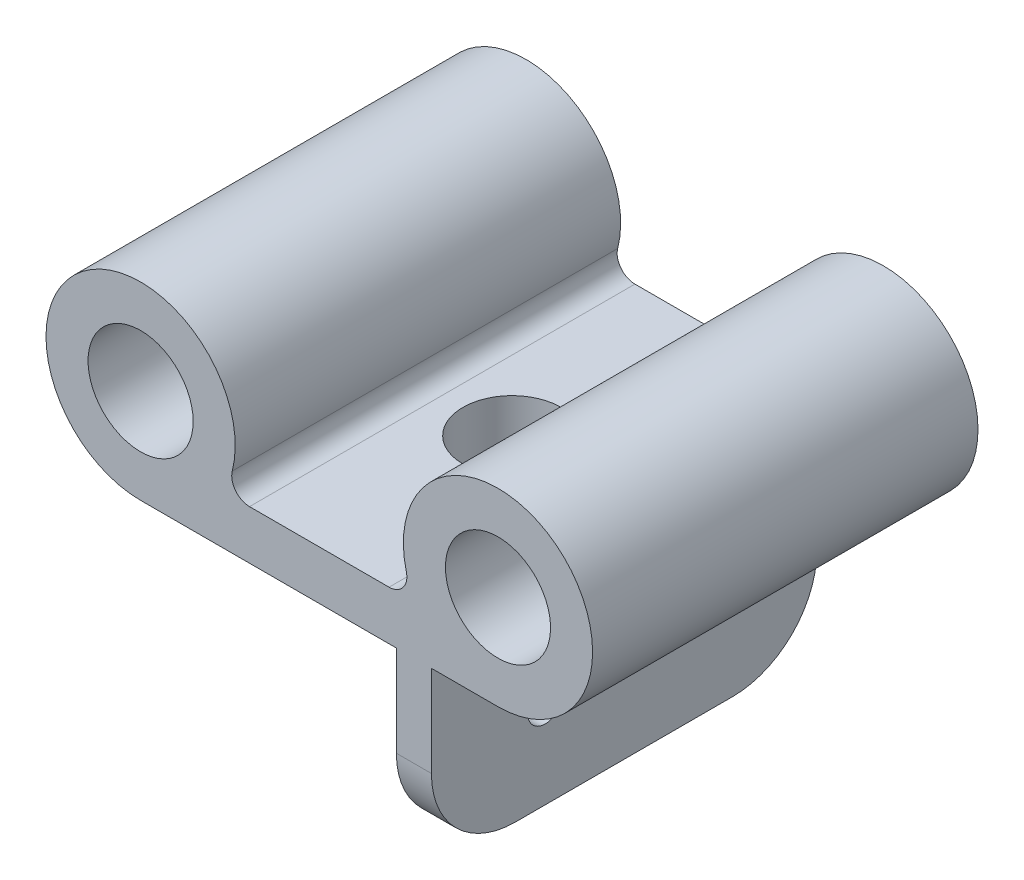
ISO-10303-21;
HEADER;
FILE_DESCRIPTION(('STEP AP214'),'2;1');
FILE_NAME('part.step','',(''),(''),'','','');
FILE_SCHEMA(('AUTOMOTIVE_DESIGN { 1 0 10303 214 1 1 1 1 }'));
ENDSEC;
DATA;
#1=APPLICATION_CONTEXT('core data for automotive mechanical design processes');
#2=APPLICATION_PROTOCOL_DEFINITION('international standard','automotive_design',2000,#1);
#3=PRODUCT_CONTEXT('',#1,'mechanical');
#4=PRODUCT('Part','Part','',(#3));
#5=PRODUCT_RELATED_PRODUCT_CATEGORY('part','',(#4));
#6=PRODUCT_DEFINITION_FORMATION('','',#4);
#7=PRODUCT_DEFINITION_CONTEXT('part definition',#1,'design');
#8=PRODUCT_DEFINITION('design','',#6,#7);
#9=PRODUCT_DEFINITION_SHAPE('','',#8);
#10=(LENGTH_UNIT() NAMED_UNIT(*) SI_UNIT(.MILLI.,.METRE.));
#11=(NAMED_UNIT(*) PLANE_ANGLE_UNIT() SI_UNIT($,.RADIAN.));
#12=(NAMED_UNIT(*) SI_UNIT($,.STERADIAN.) SOLID_ANGLE_UNIT());
#13=UNCERTAINTY_MEASURE_WITH_UNIT(LENGTH_MEASURE(1.E-05),#10,'distance_accuracy_value','');
#14=(GEOMETRIC_REPRESENTATION_CONTEXT(3) GLOBAL_UNCERTAINTY_ASSIGNED_CONTEXT((#13)) GLOBAL_UNIT_ASSIGNED_CONTEXT((#10,
#11,#12)) REPRESENTATION_CONTEXT('',''));
#15=CARTESIAN_POINT('',(0.,0.,0.));
#16=DIRECTION('',(0.,0.,1.));
#17=DIRECTION('',(1.,0.,0.));
#18=AXIS2_PLACEMENT_3D('',#15,#16,#17);
#19=CARTESIAN_POINT('',(-25.5,-13.5,55.));
#20=DIRECTION('',(0.,1.,0.));
#21=DIRECTION('',(-1.,0.,0.));
#22=AXIS2_PLACEMENT_3D('',#19,#20,#21);
#23=PLANE('',#22);
#24=DIRECTION('',(0.,0.,1.));
#25=VECTOR('',#24,1.);
#26=CARTESIAN_POINT('',(16.,-13.5,0.));
#27=LINE('',#26,#25);
#28=CARTESIAN_POINT('',(16.,-13.5,0.));
#29=VERTEX_POINT('',#28);
#30=CARTESIAN_POINT('',(16.,-13.5,55.));
#31=VERTEX_POINT('',#30);
#32=EDGE_CURVE('E147',#29,#31,#27,.T.);
#33=ORIENTED_EDGE('',*,*,#32,.F.);
#34=DIRECTION('',(1.,0.,0.));
#35=VECTOR('',#34,1.);
#36=CARTESIAN_POINT('',(-25.5,-13.5,0.));
#37=LINE('',#36,#35);
#38=CARTESIAN_POINT('',(25.5,-13.5,0.));
#39=VERTEX_POINT('',#38);
#40=EDGE_CURVE('E155',#29,#39,#37,.T.);
#41=ORIENTED_EDGE('',*,*,#40,.T.);
#42=DIRECTION('',(0.,0.,-1.));
#43=VECTOR('',#42,1.);
#44=CARTESIAN_POINT('',(25.5,-13.5,55.));
#45=LINE('',#44,#43);
#46=CARTESIAN_POINT('',(25.5,-13.5,55.));
#47=VERTEX_POINT('',#46);
#48=EDGE_CURVE('E164',#47,#39,#45,.T.);
#49=ORIENTED_EDGE('',*,*,#48,.F.);
#50=DIRECTION('',(1.,0.,0.));
#51=VECTOR('',#50,1.);
#52=CARTESIAN_POINT('',(-25.5,-13.5,55.));
#53=LINE('',#52,#51);
#54=EDGE_CURVE('E244',#31,#47,#53,.T.);
#55=ORIENTED_EDGE('',*,*,#54,.F.);
#56=EDGE_LOOP('',(#33,#41,#49,#55));
#57=FACE_BOUND('',#56,.T.);
#58=ADVANCED_FACE('F35',(#57),#23,.F.);
#59=CARTESIAN_POINT('',(25.5,0.,55.));
#60=DIRECTION('',(0.,0.,-1.));
#61=DIRECTION('',(-1.,0.,0.));
#62=AXIS2_PLACEMENT_3D('',#59,#60,#61);
#63=PLANE('',#62);
#64=DIRECTION('',(0.,1.,0.));
#65=VECTOR('',#64,1.);
#66=CARTESIAN_POINT('',(11.,-38.5,55.));
#67=LINE('',#66,#65);
#68=CARTESIAN_POINT('',(11.,-26.5,55.));
#69=VERTEX_POINT('',#68);
#70=CARTESIAN_POINT('',(11.,-13.5,55.));
#71=VERTEX_POINT('',#70);
#72=EDGE_CURVE('E143',#69,#71,#67,.T.);
#73=ORIENTED_EDGE('',*,*,#72,.F.);
#74=DIRECTION('',(-1.,0.,0.));
#75=VECTOR('',#74,1.);
#76=CARTESIAN_POINT('',(16.,-26.5,55.));
#77=LINE('',#76,#75);
#78=CARTESIAN_POINT('',(16.,-26.5,55.));
#79=VERTEX_POINT('',#78);
#80=EDGE_CURVE('E60',#69,#79,#77,.F.);
#81=ORIENTED_EDGE('',*,*,#80,.T.);
#82=DIRECTION('',(0.,1.,0.));
#83=VECTOR('',#82,1.);
#84=CARTESIAN_POINT('',(16.,-38.5,55.));
#85=LINE('',#84,#83);
#86=EDGE_CURVE('E225',#79,#31,#85,.T.);
#87=ORIENTED_EDGE('',*,*,#86,.T.);
#88=ORIENTED_EDGE('',*,*,#54,.T.);
#89=CARTESIAN_POINT('',(25.5,0.,55.));
#90=DIRECTION('',(0.,0.,1.));
#91=DIRECTION('',(-1.,0.,0.));
#92=AXIS2_PLACEMENT_3D('',#89,#90,#91);
#93=CIRCLE('',#92,13.5);
#94=CARTESIAN_POINT('',(12.4178878017809,-3.33291770573566,55.));
#95=VERTEX_POINT('',#94);
#96=EDGE_CURVE('E154',#47,#95,#93,.T.);
#97=ORIENTED_EDGE('',*,*,#96,.T.);
#98=CARTESIAN_POINT('',(9.95651261781964,-3.96,55.));
#99=DIRECTION('',(0.,0.,-1.));
#100=DIRECTION('',(-1.,0.,0.));
#101=AXIS2_PLACEMENT_3D('',#98,#99,#100);
#102=CIRCLE('',#101,2.54);
#103=CARTESIAN_POINT('',(9.95651261781964,-6.5,55.));
#104=VERTEX_POINT('',#103);
#105=EDGE_CURVE('E181',#95,#104,#102,.T.);
#106=ORIENTED_EDGE('',*,*,#105,.T.);
#107=DIRECTION('',(-1.,0.,0.));
#108=VECTOR('',#107,1.);
#109=CARTESIAN_POINT('',(-13.6678404338008,-6.5,55.));
#110=LINE('',#109,#108);
#111=CARTESIAN_POINT('',(-9.95651261781964,-6.5,55.));
#112=VERTEX_POINT('',#111);
#113=EDGE_CURVE('E158',#104,#112,#110,.T.);
#114=ORIENTED_EDGE('',*,*,#113,.T.);
#115=CARTESIAN_POINT('',(-9.95651261781964,-3.96,55.));
#116=DIRECTION('',(0.,0.,-1.));
#117=DIRECTION('',(-1.,0.,0.));
#118=AXIS2_PLACEMENT_3D('',#115,#116,#117);
#119=CIRCLE('',#118,2.54);
#120=CARTESIAN_POINT('',(-12.4178878017809,-3.33291770573566,55.));
#121=VERTEX_POINT('',#120);
#122=EDGE_CURVE('E185',#112,#121,#119,.T.);
#123=ORIENTED_EDGE('',*,*,#122,.T.);
#124=CARTESIAN_POINT('',(-25.5,0.,55.));
#125=DIRECTION('',(0.,0.,1.));
#126=DIRECTION('',(1.,0.,0.));
#127=AXIS2_PLACEMENT_3D('',#124,#125,#126);
#128=CIRCLE('',#127,13.5);
#129=CARTESIAN_POINT('',(-25.5,-13.5,55.));
#130=VERTEX_POINT('',#129);
#131=EDGE_CURVE('E242',#121,#130,#128,.T.);
#132=ORIENTED_EDGE('',*,*,#131,.T.);
#133=EDGE_CURVE('E167',#130,#71,#53,.T.);
#134=ORIENTED_EDGE('',*,*,#133,.T.);
#135=EDGE_LOOP('',(#73,#81,#87,#88,#97,#106,#114,#123,#132,#134));
#136=FACE_BOUND('',#135,.T.);
#137=CARTESIAN_POINT('',(-25.5,0.,55.));
#138=DIRECTION('',(0.,0.,1.));
#139=DIRECTION('',(1.,0.,0.));
#140=AXIS2_PLACEMENT_3D('',#137,#138,#139);
#141=CIRCLE('',#140,7.5);
#142=CARTESIAN_POINT('',(-18.,0.,55.));
#143=VERTEX_POINT('',#142);
#144=EDGE_CURVE('E234',#143,#143,#141,.T.);
#145=ORIENTED_EDGE('',*,*,#144,.F.);
#146=EDGE_LOOP('',(#145));
#147=FACE_BOUND('',#146,.T.);
#148=CARTESIAN_POINT('',(25.5,0.,55.));
#149=DIRECTION('',(0.,0.,1.));
#150=DIRECTION('',(-1.,0.,0.));
#151=AXIS2_PLACEMENT_3D('',#148,#149,#150);
#152=CIRCLE('',#151,7.5);
#153=CARTESIAN_POINT('',(18.,0.,55.));
#154=VERTEX_POINT('',#153);
#155=EDGE_CURVE('E228',#154,#154,#152,.T.);
#156=ORIENTED_EDGE('',*,*,#155,.F.);
#157=EDGE_LOOP('',(#156));
#158=FACE_BOUND('',#157,.T.);
#159=ADVANCED_FACE('F262',(#136,#147,#158),#63,.F.);
#160=CARTESIAN_POINT('',(25.5,0.,0.));
#161=DIRECTION('',(0.,0.,-1.));
#162=DIRECTION('',(-1.,0.,0.));
#163=AXIS2_PLACEMENT_3D('',#160,#161,#162);
#164=PLANE('',#163);
#165=CARTESIAN_POINT('',(-25.5,0.,0.));
#166=DIRECTION('',(0.,0.,1.));
#167=DIRECTION('',(1.,0.,0.));
#168=AXIS2_PLACEMENT_3D('',#165,#166,#167);
#169=CIRCLE('',#168,7.5);
#170=CARTESIAN_POINT('',(-18.,0.,0.));
#171=VERTEX_POINT('',#170);
#172=EDGE_CURVE('E231',#171,#171,#169,.T.);
#173=ORIENTED_EDGE('',*,*,#172,.T.);
#174=EDGE_LOOP('',(#173));
#175=FACE_BOUND('',#174,.T.);
#176=DIRECTION('',(0.,1.,0.));
#177=VECTOR('',#176,1.);
#178=CARTESIAN_POINT('',(16.,-38.5,0.));
#179=LINE('',#178,#177);
#180=CARTESIAN_POINT('',(16.,-26.5,0.));
#181=VERTEX_POINT('',#180);
#182=EDGE_CURVE('E137',#181,#29,#179,.T.);
#183=ORIENTED_EDGE('',*,*,#182,.F.);
#184=DIRECTION('',(1.,0.,0.));
#185=VECTOR('',#184,1.);
#186=CARTESIAN_POINT('',(25.5,-26.5,0.));
#187=LINE('',#186,#185);
#188=CARTESIAN_POINT('',(11.,-26.5,0.));
#189=VERTEX_POINT('',#188);
#190=EDGE_CURVE('E11',#181,#189,#187,.F.);
#191=ORIENTED_EDGE('',*,*,#190,.T.);
#192=DIRECTION('',(0.,1.,0.));
#193=VECTOR('',#192,1.);
#194=CARTESIAN_POINT('',(11.,-38.5,0.));
#195=LINE('',#194,#193);
#196=CARTESIAN_POINT('',(11.,-13.5,0.));
#197=VERTEX_POINT('',#196);
#198=EDGE_CURVE('E126',#189,#197,#195,.T.);
#199=ORIENTED_EDGE('',*,*,#198,.T.);
#200=CARTESIAN_POINT('',(-25.5,-13.5,0.));
#201=VERTEX_POINT('',#200);
#202=EDGE_CURVE('E132',#201,#197,#37,.T.);
#203=ORIENTED_EDGE('',*,*,#202,.F.);
#204=CARTESIAN_POINT('',(-25.5,0.,0.));
#205=DIRECTION('',(0.,0.,1.));
#206=DIRECTION('',(1.,0.,0.));
#207=AXIS2_PLACEMENT_3D('',#204,#205,#206);
#208=CIRCLE('',#207,13.5);
#209=CARTESIAN_POINT('',(-12.4178878017809,-3.33291770573566,0.));
#210=VERTEX_POINT('',#209);
#211=EDGE_CURVE('E160',#210,#201,#208,.T.);
#212=ORIENTED_EDGE('',*,*,#211,.F.);
#213=CARTESIAN_POINT('',(-9.95651261781964,-3.96,0.));
#214=DIRECTION('',(0.,0.,-1.));
#215=DIRECTION('',(-1.,0.,0.));
#216=AXIS2_PLACEMENT_3D('',#213,#214,#215);
#217=CIRCLE('',#216,2.54);
#218=CARTESIAN_POINT('',(-9.95651261781964,-6.5,0.));
#219=VERTEX_POINT('',#218);
#220=EDGE_CURVE('E183',#210,#219,#217,.F.);
#221=ORIENTED_EDGE('',*,*,#220,.T.);
#222=DIRECTION('',(-1.,0.,0.));
#223=VECTOR('',#222,1.);
#224=CARTESIAN_POINT('',(-13.6678404338008,-6.5,0.));
#225=LINE('',#224,#223);
#226=CARTESIAN_POINT('',(9.95651261781964,-6.5,0.));
#227=VERTEX_POINT('',#226);
#228=EDGE_CURVE('E247',#227,#219,#225,.T.);
#229=ORIENTED_EDGE('',*,*,#228,.F.);
#230=CARTESIAN_POINT('',(9.95651261781964,-3.96,0.));
#231=DIRECTION('',(0.,0.,-1.));
#232=DIRECTION('',(-1.,0.,0.));
#233=AXIS2_PLACEMENT_3D('',#230,#231,#232);
#234=CIRCLE('',#233,2.54);
#235=CARTESIAN_POINT('',(12.4178878017809,-3.33291770573566,0.));
#236=VERTEX_POINT('',#235);
#237=EDGE_CURVE('E179',#227,#236,#234,.F.);
#238=ORIENTED_EDGE('',*,*,#237,.T.);
#239=CARTESIAN_POINT('',(25.5,0.,0.));
#240=DIRECTION('',(0.,0.,1.));
#241=DIRECTION('',(-1.,0.,0.));
#242=AXIS2_PLACEMENT_3D('',#239,#240,#241);
#243=CIRCLE('',#242,13.5);
#244=EDGE_CURVE('E237',#39,#236,#243,.T.);
#245=ORIENTED_EDGE('',*,*,#244,.F.);
#246=ORIENTED_EDGE('',*,*,#40,.F.);
#247=EDGE_LOOP('',(#183,#191,#199,#203,#212,#221,#229,#238,#245,#246));
#248=FACE_BOUND('',#247,.T.);
#249=CARTESIAN_POINT('',(25.5,0.,0.));
#250=DIRECTION('',(0.,0.,1.));
#251=DIRECTION('',(-1.,0.,0.));
#252=AXIS2_PLACEMENT_3D('',#249,#250,#251);
#253=CIRCLE('',#252,7.5);
#254=CARTESIAN_POINT('',(18.,0.,0.));
#255=VERTEX_POINT('',#254);
#256=EDGE_CURVE('E136',#255,#255,#253,.T.);
#257=ORIENTED_EDGE('',*,*,#256,.T.);
#258=EDGE_LOOP('',(#257));
#259=FACE_BOUND('',#258,.T.);
#260=ADVANCED_FACE('F128',(#175,#248,#259),#164,.T.);
#261=CARTESIAN_POINT('',(25.5,0.,55.));
#262=DIRECTION('',(0.,0.,-1.));
#263=DIRECTION('',(-1.,0.,0.));
#264=AXIS2_PLACEMENT_3D('',#261,#262,#263);
#265=CYLINDRICAL_SURFACE('',#264,13.5);
#266=ORIENTED_EDGE('',*,*,#244,.T.);
#267=DIRECTION('',(0.,0.,-1.));
#268=VECTOR('',#267,1.);
#269=CARTESIAN_POINT('',(12.4178878017809,-3.33291770573566,55.));
#270=LINE('',#269,#268);
#271=EDGE_CURVE('E174',#236,#95,#270,.F.);
#272=ORIENTED_EDGE('',*,*,#271,.T.);
#273=ORIENTED_EDGE('',*,*,#96,.F.);
#274=ORIENTED_EDGE('',*,*,#48,.T.);
#275=EDGE_LOOP('',(#266,#272,#273,#274));
#276=FACE_BOUND('',#275,.T.);
#277=ADVANCED_FACE('F272',(#276),#265,.T.);
#278=CARTESIAN_POINT('',(-13.6678404338008,-6.5,55.));
#279=DIRECTION('',(0.,-1.,0.));
#280=DIRECTION('',(1.,0.,0.));
#281=AXIS2_PLACEMENT_3D('',#278,#279,#280);
#282=PLANE('',#281);
#283=CARTESIAN_POINT('',(0.,-6.5,27.5));
#284=DIRECTION('',(0.,-1.,0.));
#285=DIRECTION('',(1.,0.,0.));
#286=AXIS2_PLACEMENT_3D('',#283,#284,#285);
#287=CIRCLE('',#286,7.);
#288=CARTESIAN_POINT('',(6.99999999999999,-6.5,27.5));
#289=VERTEX_POINT('',#288);
#290=EDGE_CURVE('E148',#289,#289,#287,.T.);
#291=ORIENTED_EDGE('',*,*,#290,.T.);
#292=EDGE_LOOP('',(#291));
#293=FACE_BOUND('',#292,.T.);
#294=ORIENTED_EDGE('',*,*,#113,.F.);
#295=DIRECTION('',(0.,0.,1.));
#296=VECTOR('',#295,1.);
#297=CARTESIAN_POINT('',(9.95651261781964,-6.5,0.));
#298=LINE('',#297,#296);
#299=EDGE_CURVE('E171',#104,#227,#298,.F.);
#300=ORIENTED_EDGE('',*,*,#299,.T.);
#301=ORIENTED_EDGE('',*,*,#228,.T.);
#302=DIRECTION('',(0.,0.,1.));
#303=VECTOR('',#302,1.);
#304=CARTESIAN_POINT('',(-9.95651261781964,-6.5,55.));
#305=LINE('',#304,#303);
#306=EDGE_CURVE('E169',#219,#112,#305,.T.);
#307=ORIENTED_EDGE('',*,*,#306,.T.);
#308=EDGE_LOOP('',(#294,#300,#301,#307));
#309=FACE_BOUND('',#308,.T.);
#310=ADVANCED_FACE('F260',(#293,#309),#282,.F.);
#311=CARTESIAN_POINT('',(-25.5,0.,55.));
#312=DIRECTION('',(0.,0.,-1.));
#313=DIRECTION('',(-1.,0.,0.));
#314=AXIS2_PLACEMENT_3D('',#311,#312,#313);
#315=CYLINDRICAL_SURFACE('',#314,13.5);
#316=ORIENTED_EDGE('',*,*,#131,.F.);
#317=DIRECTION('',(0.,0.,-1.));
#318=VECTOR('',#317,1.);
#319=CARTESIAN_POINT('',(-12.4178878017809,-3.33291770573566,55.));
#320=LINE('',#319,#318);
#321=EDGE_CURVE('E176',#121,#210,#320,.T.);
#322=ORIENTED_EDGE('',*,*,#321,.T.);
#323=ORIENTED_EDGE('',*,*,#211,.T.);
#324=DIRECTION('',(0.,0.,-1.));
#325=VECTOR('',#324,1.);
#326=CARTESIAN_POINT('',(-25.5,-13.5,55.));
#327=LINE('',#326,#325);
#328=EDGE_CURVE('E153',#130,#201,#327,.T.);
#329=ORIENTED_EDGE('',*,*,#328,.F.);
#330=EDGE_LOOP('',(#316,#322,#323,#329));
#331=FACE_BOUND('',#330,.T.);
#332=ADVANCED_FACE('F254',(#331),#315,.T.);
#333=CARTESIAN_POINT('',(0.,-13.5,27.5));
#334=DIRECTION('',(0.,-1.,0.));
#335=DIRECTION('',(1.,0.,0.));
#336=AXIS2_PLACEMENT_3D('',#333,#334,#335);
#337=CIRCLE('',#336,7.);
#338=CARTESIAN_POINT('',(6.99999999999999,-13.5,27.5));
#339=VERTEX_POINT('',#338);
#340=EDGE_CURVE('E201',#339,#339,#337,.T.);
#341=ORIENTED_EDGE('',*,*,#340,.F.);
#342=EDGE_LOOP('',(#341));
#343=FACE_BOUND('',#342,.T.);
#344=ORIENTED_EDGE('',*,*,#202,.T.);
#345=DIRECTION('',(0.,0.,1.));
#346=VECTOR('',#345,1.);
#347=CARTESIAN_POINT('',(11.,-13.5,0.));
#348=LINE('',#347,#346);
#349=EDGE_CURVE('E140',#197,#71,#348,.T.);
#350=ORIENTED_EDGE('',*,*,#349,.T.);
#351=ORIENTED_EDGE('',*,*,#133,.F.);
#352=ORIENTED_EDGE('',*,*,#328,.T.);
#353=EDGE_LOOP('',(#344,#350,#351,#352));
#354=FACE_BOUND('',#353,.T.);
#355=ADVANCED_FACE('F151',(#343,#354),#23,.F.);
#356=CARTESIAN_POINT('',(-25.5,0.,55.));
#357=DIRECTION('',(0.,0.,-1.));
#358=DIRECTION('',(-1.,0.,0.));
#359=AXIS2_PLACEMENT_3D('',#356,#357,#358);
#360=CYLINDRICAL_SURFACE('',#359,7.5);
#361=ORIENTED_EDGE('',*,*,#144,.T.);
#362=EDGE_LOOP('',(#361));
#363=FACE_BOUND('',#362,.T.);
#364=ORIENTED_EDGE('',*,*,#172,.F.);
#365=EDGE_LOOP('',(#364));
#366=FACE_BOUND('',#365,.T.);
#367=ADVANCED_FACE('F307',(#363,#366),#360,.F.);
#368=CARTESIAN_POINT('',(25.5,0.,55.));
#369=DIRECTION('',(0.,0.,-1.));
#370=DIRECTION('',(-1.,0.,0.));
#371=AXIS2_PLACEMENT_3D('',#368,#369,#370);
#372=CYLINDRICAL_SURFACE('',#371,7.5);
#373=ORIENTED_EDGE('',*,*,#155,.T.);
#374=EDGE_LOOP('',(#373));
#375=FACE_BOUND('',#374,.T.);
#376=ORIENTED_EDGE('',*,*,#256,.F.);
#377=EDGE_LOOP('',(#376));
#378=FACE_BOUND('',#377,.T.);
#379=ADVANCED_FACE('F313',(#375,#378),#372,.F.);
#380=CARTESIAN_POINT('',(9.95651261781964,-3.96,55.));
#381=DIRECTION('',(0.,0.,-1.));
#382=DIRECTION('',(-1.,0.,0.));
#383=AXIS2_PLACEMENT_3D('',#380,#381,#382);
#384=CYLINDRICAL_SURFACE('',#383,2.54);
#385=ORIENTED_EDGE('',*,*,#105,.F.);
#386=ORIENTED_EDGE('',*,*,#271,.F.);
#387=ORIENTED_EDGE('',*,*,#237,.F.);
#388=ORIENTED_EDGE('',*,*,#299,.F.);
#389=EDGE_LOOP('',(#385,#386,#387,#388));
#390=FACE_BOUND('',#389,.T.);
#391=ADVANCED_FACE('F268',(#390),#384,.F.);
#392=CARTESIAN_POINT('',(-9.95651261781964,-3.96,55.));
#393=DIRECTION('',(0.,0.,-1.));
#394=DIRECTION('',(-1.,0.,0.));
#395=AXIS2_PLACEMENT_3D('',#392,#393,#394);
#396=CYLINDRICAL_SURFACE('',#395,2.54);
#397=ORIENTED_EDGE('',*,*,#122,.F.);
#398=ORIENTED_EDGE('',*,*,#306,.F.);
#399=ORIENTED_EDGE('',*,*,#220,.F.);
#400=ORIENTED_EDGE('',*,*,#321,.F.);
#401=EDGE_LOOP('',(#397,#398,#399,#400));
#402=FACE_BOUND('',#401,.T.);
#403=ADVANCED_FACE('F258',(#402),#396,.F.);
#404=CARTESIAN_POINT('',(11.,-38.5,0.));
#405=DIRECTION('',(-1.,0.,0.));
#406=DIRECTION('',(0.,-1.,0.));
#407=AXIS2_PLACEMENT_3D('',#404,#405,#406);
#408=PLANE('',#407);
#409=CARTESIAN_POINT('',(11.,-26.,38.75));
#410=DIRECTION('',(-1.,0.,0.));
#411=DIRECTION('',(0.,-1.,0.));
#412=AXIS2_PLACEMENT_3D('',#409,#410,#411);
#413=CIRCLE('',#412,2.5);
#414=CARTESIAN_POINT('',(11.,-28.5,38.75));
#415=VERTEX_POINT('',#414);
#416=EDGE_CURVE('E212',#415,#415,#413,.T.);
#417=ORIENTED_EDGE('',*,*,#416,.F.);
#418=EDGE_LOOP('',(#417));
#419=FACE_BOUND('',#418,.T.);
#420=CARTESIAN_POINT('',(11.,-26.,16.25));
#421=DIRECTION('',(-1.,0.,0.));
#422=DIRECTION('',(0.,-1.,0.));
#423=AXIS2_PLACEMENT_3D('',#420,#421,#422);
#424=CIRCLE('',#423,2.5);
#425=CARTESIAN_POINT('',(11.,-28.5,16.25));
#426=VERTEX_POINT('',#425);
#427=EDGE_CURVE('E202',#426,#426,#424,.T.);
#428=ORIENTED_EDGE('',*,*,#427,.F.);
#429=EDGE_LOOP('',(#428));
#430=FACE_BOUND('',#429,.T.);
#431=DIRECTION('',(0.,0.,1.));
#432=VECTOR('',#431,1.);
#433=CARTESIAN_POINT('',(11.,-38.5,0.));
#434=LINE('',#433,#432);
#435=CARTESIAN_POINT('',(11.,-38.5,12.));
#436=VERTEX_POINT('',#435);
#437=CARTESIAN_POINT('',(11.,-38.5,43.));
#438=VERTEX_POINT('',#437);
#439=EDGE_CURVE('E217',#436,#438,#434,.T.);
#440=ORIENTED_EDGE('',*,*,#439,.T.);
#441=CARTESIAN_POINT('',(11.,-26.5,43.));
#442=DIRECTION('',(-1.,0.,0.));
#443=DIRECTION('',(0.,-1.,0.));
#444=AXIS2_PLACEMENT_3D('',#441,#442,#443);
#445=CIRCLE('',#444,12.);
#446=EDGE_CURVE('E195',#438,#69,#445,.T.);
#447=ORIENTED_EDGE('',*,*,#446,.T.);
#448=ORIENTED_EDGE('',*,*,#72,.T.);
#449=ORIENTED_EDGE('',*,*,#349,.F.);
#450=ORIENTED_EDGE('',*,*,#198,.F.);
#451=CARTESIAN_POINT('',(11.,-26.5,12.));
#452=DIRECTION('',(-1.,0.,0.));
#453=DIRECTION('',(0.,-1.,0.));
#454=AXIS2_PLACEMENT_3D('',#451,#452,#453);
#455=CIRCLE('',#454,12.);
#456=EDGE_CURVE('E193',#189,#436,#455,.T.);
#457=ORIENTED_EDGE('',*,*,#456,.T.);
#458=EDGE_LOOP('',(#440,#447,#448,#449,#450,#457));
#459=FACE_BOUND('',#458,.T.);
#460=ADVANCED_FACE('F142',(#419,#430,#459),#408,.T.);
#461=CARTESIAN_POINT('',(16.,-38.5,0.));
#462=DIRECTION('',(-1.,0.,0.));
#463=DIRECTION('',(0.,-1.,0.));
#464=AXIS2_PLACEMENT_3D('',#461,#462,#463);
#465=PLANE('',#464);
#466=CARTESIAN_POINT('',(16.,-26.,38.75));
#467=DIRECTION('',(-1.,0.,0.));
#468=DIRECTION('',(0.,-1.,0.));
#469=AXIS2_PLACEMENT_3D('',#466,#467,#468);
#470=CIRCLE('',#469,2.5);
#471=CARTESIAN_POINT('',(16.,-28.5,38.75));
#472=VERTEX_POINT('',#471);
#473=EDGE_CURVE('E39',#472,#472,#470,.T.);
#474=ORIENTED_EDGE('',*,*,#473,.T.);
#475=EDGE_LOOP('',(#474));
#476=FACE_BOUND('',#475,.T.);
#477=CARTESIAN_POINT('',(16.,-26.,16.25));
#478=DIRECTION('',(-1.,0.,0.));
#479=DIRECTION('',(0.,-1.,0.));
#480=AXIS2_PLACEMENT_3D('',#477,#478,#479);
#481=CIRCLE('',#480,2.5);
#482=CARTESIAN_POINT('',(16.,-28.5,16.25));
#483=VERTEX_POINT('',#482);
#484=EDGE_CURVE('E199',#483,#483,#481,.T.);
#485=ORIENTED_EDGE('',*,*,#484,.T.);
#486=EDGE_LOOP('',(#485));
#487=FACE_BOUND('',#486,.T.);
#488=ORIENTED_EDGE('',*,*,#86,.F.);
#489=CARTESIAN_POINT('',(16.,-26.5,43.));
#490=DIRECTION('',(-1.,0.,0.));
#491=DIRECTION('',(0.,-1.,0.));
#492=AXIS2_PLACEMENT_3D('',#489,#490,#491);
#493=CIRCLE('',#492,12.);
#494=CARTESIAN_POINT('',(16.,-38.5,43.));
#495=VERTEX_POINT('',#494);
#496=EDGE_CURVE('E44',#79,#495,#493,.F.);
#497=ORIENTED_EDGE('',*,*,#496,.T.);
#498=DIRECTION('',(0.,0.,1.));
#499=VECTOR('',#498,1.);
#500=CARTESIAN_POINT('',(16.,-38.5,0.));
#501=LINE('',#500,#499);
#502=CARTESIAN_POINT('',(16.,-38.5,12.));
#503=VERTEX_POINT('',#502);
#504=EDGE_CURVE('E219',#503,#495,#501,.T.);
#505=ORIENTED_EDGE('',*,*,#504,.F.);
#506=CARTESIAN_POINT('',(16.,-26.5,12.));
#507=DIRECTION('',(-1.,0.,0.));
#508=DIRECTION('',(0.,-1.,0.));
#509=AXIS2_PLACEMENT_3D('',#506,#507,#508);
#510=CIRCLE('',#509,12.);
#511=EDGE_CURVE('E52',#503,#181,#510,.F.);
#512=ORIENTED_EDGE('',*,*,#511,.T.);
#513=ORIENTED_EDGE('',*,*,#182,.T.);
#514=ORIENTED_EDGE('',*,*,#32,.T.);
#515=EDGE_LOOP('',(#488,#497,#505,#512,#513,#514));
#516=FACE_BOUND('',#515,.T.);
#517=ADVANCED_FACE('F286',(#476,#487,#516),#465,.F.);
#518=CARTESIAN_POINT('',(0.,-38.5,0.));
#519=DIRECTION('',(0.,-1.,0.));
#520=DIRECTION('',(1.,0.,0.));
#521=AXIS2_PLACEMENT_3D('',#518,#519,#520);
#522=PLANE('',#521);
#523=ORIENTED_EDGE('',*,*,#504,.T.);
#524=DIRECTION('',(-1.,0.,0.));
#525=VECTOR('',#524,1.);
#526=CARTESIAN_POINT('',(11.,-38.5,43.));
#527=LINE('',#526,#525);
#528=EDGE_CURVE('E190',#495,#438,#527,.T.);
#529=ORIENTED_EDGE('',*,*,#528,.T.);
#530=ORIENTED_EDGE('',*,*,#439,.F.);
#531=DIRECTION('',(1.,0.,0.));
#532=VECTOR('',#531,1.);
#533=CARTESIAN_POINT('',(0.,-38.5,12.));
#534=LINE('',#533,#532);
#535=EDGE_CURVE('E187',#436,#503,#534,.T.);
#536=ORIENTED_EDGE('',*,*,#535,.T.);
#537=EDGE_LOOP('',(#523,#529,#530,#536));
#538=FACE_BOUND('',#537,.T.);
#539=ADVANCED_FACE('F281',(#538),#522,.T.);
#540=CARTESIAN_POINT('',(0.,13.5,27.5));
#541=DIRECTION('',(0.,-1.,0.));
#542=DIRECTION('',(1.,0.,0.));
#543=AXIS2_PLACEMENT_3D('',#540,#541,#542);
#544=CYLINDRICAL_SURFACE('',#543,7.);
#545=ORIENTED_EDGE('',*,*,#340,.T.);
#546=EDGE_LOOP('',(#545));
#547=FACE_BOUND('',#546,.T.);
#548=ORIENTED_EDGE('',*,*,#290,.F.);
#549=EDGE_LOOP('',(#548));
#550=FACE_BOUND('',#549,.T.);
#551=ADVANCED_FACE('F294',(#547,#550),#544,.F.);
#552=CARTESIAN_POINT('',(0.,-26.5,43.));
#553=DIRECTION('',(1.,0.,0.));
#554=DIRECTION('',(0.,1.,0.));
#555=AXIS2_PLACEMENT_3D('',#552,#553,#554);
#556=CYLINDRICAL_SURFACE('',#555,12.);
#557=ORIENTED_EDGE('',*,*,#496,.F.);
#558=ORIENTED_EDGE('',*,*,#80,.F.);
#559=ORIENTED_EDGE('',*,*,#446,.F.);
#560=ORIENTED_EDGE('',*,*,#528,.F.);
#561=EDGE_LOOP('',(#557,#558,#559,#560));
#562=FACE_BOUND('',#561,.T.);
#563=ADVANCED_FACE('F285',(#562),#556,.T.);
#564=CARTESIAN_POINT('',(0.,-26.5,12.));
#565=DIRECTION('',(1.,0.,0.));
#566=DIRECTION('',(0.,1.,0.));
#567=AXIS2_PLACEMENT_3D('',#564,#565,#566);
#568=CYLINDRICAL_SURFACE('',#567,12.);
#569=ORIENTED_EDGE('',*,*,#456,.F.);
#570=ORIENTED_EDGE('',*,*,#190,.F.);
#571=ORIENTED_EDGE('',*,*,#511,.F.);
#572=ORIENTED_EDGE('',*,*,#535,.F.);
#573=EDGE_LOOP('',(#569,#570,#571,#572));
#574=FACE_BOUND('',#573,.T.);
#575=ADVANCED_FACE('F37',(#574),#568,.T.);
#576=CARTESIAN_POINT('',(39.,-26.,16.25));
#577=DIRECTION('',(-1.,0.,0.));
#578=DIRECTION('',(0.,-1.,0.));
#579=AXIS2_PLACEMENT_3D('',#576,#577,#578);
#580=CYLINDRICAL_SURFACE('',#579,2.5);
#581=ORIENTED_EDGE('',*,*,#427,.T.);
#582=EDGE_LOOP('',(#581));
#583=FACE_BOUND('',#582,.T.);
#584=ORIENTED_EDGE('',*,*,#484,.F.);
#585=EDGE_LOOP('',(#584));
#586=FACE_BOUND('',#585,.T.);
#587=ADVANCED_FACE('F337',(#583,#586),#580,.F.);
#588=CARTESIAN_POINT('',(39.,-26.,38.75));
#589=DIRECTION('',(-1.,0.,0.));
#590=DIRECTION('',(0.,-1.,0.));
#591=AXIS2_PLACEMENT_3D('',#588,#589,#590);
#592=CYLINDRICAL_SURFACE('',#591,2.5);
#593=ORIENTED_EDGE('',*,*,#416,.T.);
#594=EDGE_LOOP('',(#593));
#595=FACE_BOUND('',#594,.T.);
#596=ORIENTED_EDGE('',*,*,#473,.F.);
#597=EDGE_LOOP('',(#596));
#598=FACE_BOUND('',#597,.T.);
#599=ADVANCED_FACE('F341',(#595,#598),#592,.F.);
#600=CLOSED_SHELL('',(#58,#159,#260,#277,#310,#332,#355,#367,#379,#391,#403,#460,#517,#539,#551,
#563,#575,#587,#599));
#601=MANIFOLD_SOLID_BREP('B2',#600);
#602=ADVANCED_BREP_SHAPE_REPRESENTATION('',(#18,#601),#14);
#603=SHAPE_DEFINITION_REPRESENTATION(#9,#602);
ENDSEC;
END-ISO-10303-21;
